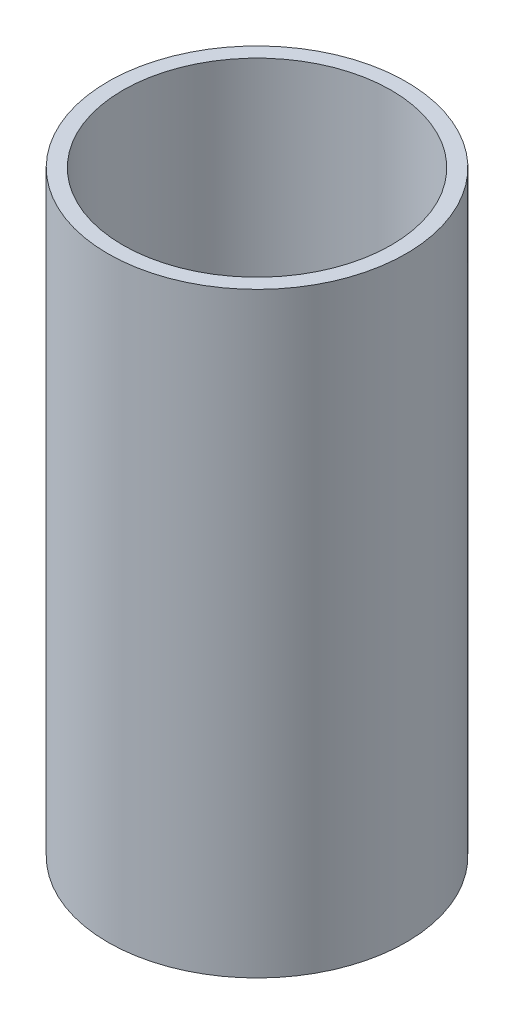
ISO-10303-21;
HEADER;
FILE_DESCRIPTION(('STEP AP214'),'2;1');
FILE_NAME('part.step','',(''),(''),'','','');
FILE_SCHEMA(('AUTOMOTIVE_DESIGN { 1 0 10303 214 1 1 1 1 }'));
ENDSEC;
DATA;
#1=APPLICATION_CONTEXT('core data for automotive mechanical design processes');
#2=APPLICATION_PROTOCOL_DEFINITION('international standard','automotive_design',2000,#1);
#3=PRODUCT_CONTEXT('',#1,'mechanical');
#4=PRODUCT('Part','Part','',(#3));
#5=PRODUCT_RELATED_PRODUCT_CATEGORY('part','',(#4));
#6=PRODUCT_DEFINITION_FORMATION('','',#4);
#7=PRODUCT_DEFINITION_CONTEXT('part definition',#1,'design');
#8=PRODUCT_DEFINITION('design','',#6,#7);
#9=PRODUCT_DEFINITION_SHAPE('','',#8);
#10=(LENGTH_UNIT() NAMED_UNIT(*) SI_UNIT(.MILLI.,.METRE.));
#11=(NAMED_UNIT(*) PLANE_ANGLE_UNIT() SI_UNIT($,.RADIAN.));
#12=(NAMED_UNIT(*) SI_UNIT($,.STERADIAN.) SOLID_ANGLE_UNIT());
#13=UNCERTAINTY_MEASURE_WITH_UNIT(LENGTH_MEASURE(1.E-05),#10,'distance_accuracy_value','');
#14=(GEOMETRIC_REPRESENTATION_CONTEXT(3) GLOBAL_UNCERTAINTY_ASSIGNED_CONTEXT((#13)) GLOBAL_UNIT_ASSIGNED_CONTEXT((#10,
#11,#12)) REPRESENTATION_CONTEXT('',''));
#15=CARTESIAN_POINT('',(0.,0.,0.));
#16=DIRECTION('',(0.,0.,1.));
#17=DIRECTION('',(1.,0.,0.));
#18=AXIS2_PLACEMENT_3D('',#15,#16,#17);
#19=CARTESIAN_POINT('',(0.,200.,0.));
#20=DIRECTION('',(0.,1.,0.));
#21=DIRECTION('',(0.,0.,1.));
#22=AXIS2_PLACEMENT_3D('',#19,#20,#21);
#23=PLANE('',#22);
#24=CARTESIAN_POINT('',(0.,200.,0.));
#25=DIRECTION('',(0.,1.,0.));
#26=DIRECTION('',(0.,0.,1.));
#27=AXIS2_PLACEMENT_3D('',#24,#25,#26);
#28=CIRCLE('',#27,50.);
#29=CARTESIAN_POINT('',(0.,200.,50.));
#30=VERTEX_POINT('',#29);
#31=EDGE_CURVE('E10',#30,#30,#28,.T.);
#32=ORIENTED_EDGE('',*,*,#31,.T.);
#33=EDGE_LOOP('',(#32));
#34=FACE_BOUND('',#33,.T.);
#35=CARTESIAN_POINT('',(0.,200.,0.));
#36=DIRECTION('',(0.,1.,0.));
#37=DIRECTION('',(0.,0.,1.));
#38=AXIS2_PLACEMENT_3D('',#35,#36,#37);
#39=CIRCLE('',#38,45.);
#40=CARTESIAN_POINT('',(0.,200.,45.));
#41=VERTEX_POINT('',#40);
#42=EDGE_CURVE('E41',#41,#41,#39,.T.);
#43=ORIENTED_EDGE('',*,*,#42,.F.);
#44=EDGE_LOOP('',(#43));
#45=FACE_BOUND('',#44,.T.);
#46=ADVANCED_FACE('F30',(#34,#45),#23,.T.);
#47=CARTESIAN_POINT('',(0.,0.,0.));
#48=DIRECTION('',(0.,1.,0.));
#49=DIRECTION('',(0.,0.,1.));
#50=AXIS2_PLACEMENT_3D('',#47,#48,#49);
#51=PLANE('',#50);
#52=CARTESIAN_POINT('',(0.,0.,0.));
#53=DIRECTION('',(0.,1.,0.));
#54=DIRECTION('',(0.,0.,1.));
#55=AXIS2_PLACEMENT_3D('',#52,#53,#54);
#56=CIRCLE('',#55,50.);
#57=CARTESIAN_POINT('',(0.,0.,50.));
#58=VERTEX_POINT('',#57);
#59=EDGE_CURVE('E34',#58,#58,#56,.T.);
#60=ORIENTED_EDGE('',*,*,#59,.F.);
#61=EDGE_LOOP('',(#60));
#62=FACE_BOUND('',#61,.T.);
#63=CARTESIAN_POINT('',(0.,0.,0.));
#64=DIRECTION('',(0.,1.,0.));
#65=DIRECTION('',(0.,0.,1.));
#66=AXIS2_PLACEMENT_3D('',#63,#64,#65);
#67=CIRCLE('',#66,45.);
#68=CARTESIAN_POINT('',(0.,0.,45.));
#69=VERTEX_POINT('',#68);
#70=EDGE_CURVE('E43',#69,#69,#67,.T.);
#71=ORIENTED_EDGE('',*,*,#70,.T.);
#72=EDGE_LOOP('',(#71));
#73=FACE_BOUND('',#72,.T.);
#74=ADVANCED_FACE('F53',(#62,#73),#51,.F.);
#75=CARTESIAN_POINT('',(0.,200.,0.));
#76=DIRECTION('',(0.,-1.,0.));
#77=DIRECTION('',(0.,0.,-1.));
#78=AXIS2_PLACEMENT_3D('',#75,#76,#77);
#79=CYLINDRICAL_SURFACE('',#78,50.);
#80=ORIENTED_EDGE('',*,*,#31,.F.);
#81=EDGE_LOOP('',(#80));
#82=FACE_BOUND('',#81,.T.);
#83=ORIENTED_EDGE('',*,*,#59,.T.);
#84=EDGE_LOOP('',(#83));
#85=FACE_BOUND('',#84,.T.);
#86=ADVANCED_FACE('F32',(#82,#85),#79,.T.);
#87=CARTESIAN_POINT('',(0.,200.,0.));
#88=DIRECTION('',(0.,-1.,0.));
#89=DIRECTION('',(0.,0.,-1.));
#90=AXIS2_PLACEMENT_3D('',#87,#88,#89);
#91=CYLINDRICAL_SURFACE('',#90,45.);
#92=ORIENTED_EDGE('',*,*,#42,.T.);
#93=EDGE_LOOP('',(#92));
#94=FACE_BOUND('',#93,.T.);
#95=ORIENTED_EDGE('',*,*,#70,.F.);
#96=EDGE_LOOP('',(#95));
#97=FACE_BOUND('',#96,.T.);
#98=ADVANCED_FACE('F49',(#94,#97),#91,.F.);
#99=CLOSED_SHELL('',(#46,#74,#86,#98));
#100=MANIFOLD_SOLID_BREP('B2',#99);
#101=ADVANCED_BREP_SHAPE_REPRESENTATION('',(#18,#100),#14);
#102=SHAPE_DEFINITION_REPRESENTATION(#9,#101);
ENDSEC;
END-ISO-10303-21;
